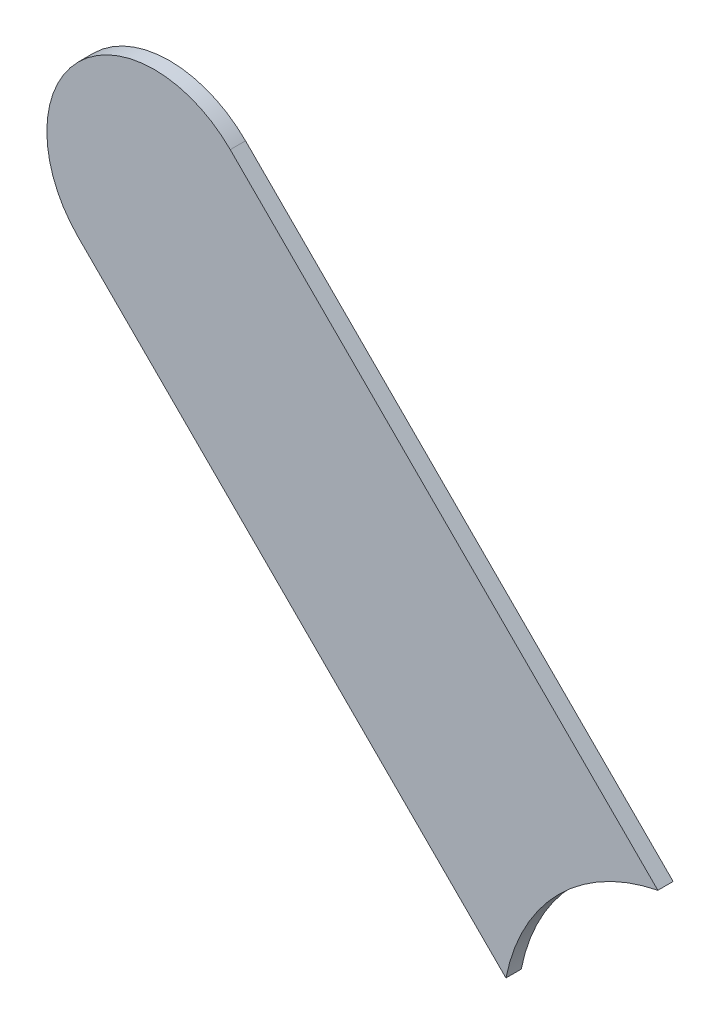
ISO-10303-21;
HEADER;
FILE_DESCRIPTION(('STEP AP214'),'2;1');
FILE_NAME('part.step','',(''),(''),'','','');
FILE_SCHEMA(('AUTOMOTIVE_DESIGN { 1 0 10303 214 1 1 1 1 }'));
ENDSEC;
DATA;
#1=APPLICATION_CONTEXT('core data for automotive mechanical design processes');
#2=APPLICATION_PROTOCOL_DEFINITION('international standard','automotive_design',2000,#1);
#3=PRODUCT_CONTEXT('',#1,'mechanical');
#4=PRODUCT('Part','Part','',(#3));
#5=PRODUCT_RELATED_PRODUCT_CATEGORY('part','',(#4));
#6=PRODUCT_DEFINITION_FORMATION('','',#4);
#7=PRODUCT_DEFINITION_CONTEXT('part definition',#1,'design');
#8=PRODUCT_DEFINITION('design','',#6,#7);
#9=PRODUCT_DEFINITION_SHAPE('','',#8);
#10=(LENGTH_UNIT() NAMED_UNIT(*) SI_UNIT(.MILLI.,.METRE.));
#11=(NAMED_UNIT(*) PLANE_ANGLE_UNIT() SI_UNIT($,.RADIAN.));
#12=(NAMED_UNIT(*) SI_UNIT($,.STERADIAN.) SOLID_ANGLE_UNIT());
#13=UNCERTAINTY_MEASURE_WITH_UNIT(LENGTH_MEASURE(1.E-05),#10,'distance_accuracy_value','');
#14=(GEOMETRIC_REPRESENTATION_CONTEXT(3) GLOBAL_UNCERTAINTY_ASSIGNED_CONTEXT((#13)) GLOBAL_UNIT_ASSIGNED_CONTEXT((#10,
#11,#12)) REPRESENTATION_CONTEXT('',''));
#15=CARTESIAN_POINT('',(0.,0.,0.));
#16=DIRECTION('',(0.,0.,1.));
#17=DIRECTION('',(1.,0.,0.));
#18=AXIS2_PLACEMENT_3D('',#15,#16,#17);
#19=CARTESIAN_POINT('',(92.39443802,110.49102362,0.));
#20=DIRECTION('',(0.707106781186548,0.707106781186548,0.));
#21=DIRECTION('',(0.707106781186548,-0.707106781186548,0.));
#22=AXIS2_PLACEMENT_3D('',#19,#20,#21);
#23=PLANE('',#22);
#24=DIRECTION('',(0.707106781186548,-0.707106781186548,0.));
#25=VECTOR('',#24,1.);
#26=CARTESIAN_POINT('',(92.39443802,110.49102362,0.03556));
#27=LINE('',#26,#25);
#28=CARTESIAN_POINT('',(92.39443802,110.49102362,0.03556));
#29=VERTEX_POINT('',#28);
#30=CARTESIAN_POINT('',(93.3896526436052,109.495808996395,0.03556));
#31=VERTEX_POINT('',#30);
#32=EDGE_CURVE('E11',#29,#31,#27,.T.);
#33=ORIENTED_EDGE('',*,*,#32,.F.);
#34=DIRECTION('',(0.,0.,1.));
#35=VECTOR('',#34,1.);
#36=CARTESIAN_POINT('',(92.39443802,110.49102362,0.));
#37=LINE('',#36,#35);
#38=CARTESIAN_POINT('',(92.39443802,110.49102362,0.));
#39=VERTEX_POINT('',#38);
#40=EDGE_CURVE('E24',#39,#29,#37,.T.);
#41=ORIENTED_EDGE('',*,*,#40,.F.);
#42=DIRECTION('',(0.707106781186548,-0.707106781186548,0.));
#43=VECTOR('',#42,1.);
#44=CARTESIAN_POINT('',(92.39443802,110.49102362,0.));
#45=LINE('',#44,#43);
#46=CARTESIAN_POINT('',(93.3896526436052,109.495808996395,0.));
#47=VERTEX_POINT('',#46);
#48=EDGE_CURVE('E75',#39,#47,#45,.T.);
#49=ORIENTED_EDGE('',*,*,#48,.T.);
#50=DIRECTION('',(0.,0.,1.));
#51=VECTOR('',#50,1.);
#52=CARTESIAN_POINT('',(93.3896526436052,109.495808996395,0.));
#53=LINE('',#52,#51);
#54=EDGE_CURVE('E37',#47,#31,#53,.T.);
#55=ORIENTED_EDGE('',*,*,#54,.T.);
#56=EDGE_LOOP('',(#33,#41,#49,#55));
#57=FACE_BOUND('',#56,.T.);
#58=ADVANCED_FACE('F17',(#57),#23,.F.);
#59=CARTESIAN_POINT('',(93.8310036,109.4080108,0.));
#60=DIRECTION('',(0.,0.,-1.));
#61=DIRECTION('',(1.,0.,0.));
#62=AXIS2_PLACEMENT_3D('',#59,#60,#61);
#63=CYLINDRICAL_SURFACE('',#62,0.4499991);
#64=DIRECTION('',(0.,0.,1.));
#65=VECTOR('',#64,1.);
#66=CARTESIAN_POINT('',(93.7432054036051,109.849361756395,0.));
#67=LINE('',#66,#65);
#68=CARTESIAN_POINT('',(93.7432054036051,109.849361756395,0.));
#69=VERTEX_POINT('',#68);
#70=CARTESIAN_POINT('',(93.7432054036051,109.849361756395,0.03556));
#71=VERTEX_POINT('',#70);
#72=EDGE_CURVE('E67',#69,#71,#67,.T.);
#73=ORIENTED_EDGE('',*,*,#72,.T.);
#74=CARTESIAN_POINT('',(93.8310036,109.4080108,0.03556));
#75=DIRECTION('',(0.,0.,1.));
#76=DIRECTION('',(1.,0.,0.));
#77=AXIS2_PLACEMENT_3D('',#74,#75,#76);
#78=CIRCLE('',#77,0.4499991);
#79=EDGE_CURVE('E82',#71,#31,#78,.T.);
#80=ORIENTED_EDGE('',*,*,#79,.T.);
#81=ORIENTED_EDGE('',*,*,#54,.F.);
#82=CARTESIAN_POINT('',(93.8310036,109.4080108,0.));
#83=DIRECTION('',(0.,0.,1.));
#84=DIRECTION('',(1.,0.,0.));
#85=AXIS2_PLACEMENT_3D('',#82,#83,#84);
#86=CIRCLE('',#85,0.4499991);
#87=EDGE_CURVE('E80',#69,#47,#86,.T.);
#88=ORIENTED_EDGE('',*,*,#87,.F.);
#89=EDGE_LOOP('',(#73,#80,#81,#88));
#90=FACE_BOUND('',#89,.T.);
#91=ADVANCED_FACE('F88',(#90),#63,.F.);
#92=CARTESIAN_POINT('',(93.7432054036051,109.849361756395,0.));
#93=DIRECTION('',(-0.707106781186548,-0.707106781186548,0.));
#94=DIRECTION('',(-0.707106781186548,0.707106781186548,0.));
#95=AXIS2_PLACEMENT_3D('',#92,#93,#94);
#96=PLANE('',#95);
#97=DIRECTION('',(-0.707106781186548,0.707106781186548,0.));
#98=VECTOR('',#97,1.);
#99=CARTESIAN_POINT('',(94.00777998,109.58478718,0.03556));
#100=LINE('',#99,#98);
#101=CARTESIAN_POINT('',(92.74799078,110.84457638,0.03556));
#102=VERTEX_POINT('',#101);
#103=EDGE_CURVE('E71',#71,#102,#100,.T.);
#104=ORIENTED_EDGE('',*,*,#103,.F.);
#105=ORIENTED_EDGE('',*,*,#72,.F.);
#106=DIRECTION('',(-0.707106781186548,0.707106781186548,0.));
#107=VECTOR('',#106,1.);
#108=CARTESIAN_POINT('',(94.00777998,109.58478718,0.));
#109=LINE('',#108,#107);
#110=CARTESIAN_POINT('',(92.74799078,110.84457638,0.));
#111=VERTEX_POINT('',#110);
#112=EDGE_CURVE('E63',#69,#111,#109,.T.);
#113=ORIENTED_EDGE('',*,*,#112,.T.);
#114=DIRECTION('',(0.,0.,1.));
#115=VECTOR('',#114,1.);
#116=CARTESIAN_POINT('',(92.74799078,110.84457638,0.));
#117=LINE('',#116,#115);
#118=EDGE_CURVE('E53',#111,#102,#117,.T.);
#119=ORIENTED_EDGE('',*,*,#118,.T.);
#120=EDGE_LOOP('',(#104,#105,#113,#119));
#121=FACE_BOUND('',#120,.T.);
#122=ADVANCED_FACE('F66',(#121),#96,.F.);
#123=CARTESIAN_POINT('',(92.5712144,110.6678,0.));
#124=DIRECTION('',(0.,0.,-1.));
#125=DIRECTION('',(0.707106781186548,0.707106781186548,0.));
#126=AXIS2_PLACEMENT_3D('',#123,#124,#125);
#127=CYLINDRICAL_SURFACE('',#126,0.249999554103216);
#128=CARTESIAN_POINT('',(92.5712144,110.6678,0.03556));
#129=DIRECTION('',(0.,0.,1.));
#130=DIRECTION('',(0.707106781186548,0.707106781186548,0.));
#131=AXIS2_PLACEMENT_3D('',#128,#129,#130);
#132=CIRCLE('',#131,0.249999554103216);
#133=EDGE_CURVE('E59',#102,#29,#132,.T.);
#134=ORIENTED_EDGE('',*,*,#133,.F.);
#135=ORIENTED_EDGE('',*,*,#118,.F.);
#136=CARTESIAN_POINT('',(92.5712144,110.6678,0.));
#137=DIRECTION('',(0.,0.,1.));
#138=DIRECTION('',(0.707106781186548,0.707106781186548,0.));
#139=AXIS2_PLACEMENT_3D('',#136,#137,#138);
#140=CIRCLE('',#139,0.249999554103216);
#141=EDGE_CURVE('E57',#111,#39,#140,.T.);
#142=ORIENTED_EDGE('',*,*,#141,.T.);
#143=ORIENTED_EDGE('',*,*,#40,.T.);
#144=EDGE_LOOP('',(#134,#135,#142,#143));
#145=FACE_BOUND('',#144,.T.);
#146=ADVANCED_FACE('F55',(#145),#127,.T.);
#147=CARTESIAN_POINT('',(92.39443802,110.49102362,0.));
#148=DIRECTION('',(0.,0.,-1.));
#149=DIRECTION('',(-1.,0.,0.));
#150=AXIS2_PLACEMENT_3D('',#147,#148,#149);
#151=PLANE('',#150);
#152=ORIENTED_EDGE('',*,*,#48,.F.);
#153=ORIENTED_EDGE('',*,*,#141,.F.);
#154=ORIENTED_EDGE('',*,*,#112,.F.);
#155=ORIENTED_EDGE('',*,*,#87,.T.);
#156=EDGE_LOOP('',(#152,#153,#154,#155));
#157=FACE_BOUND('',#156,.T.);
#158=ADVANCED_FACE('F74',(#157),#151,.T.);
#159=CARTESIAN_POINT('',(92.39443802,110.49102362,0.03556));
#160=DIRECTION('',(0.,0.,-1.));
#161=DIRECTION('',(-1.,0.,0.));
#162=AXIS2_PLACEMENT_3D('',#159,#160,#161);
#163=PLANE('',#162);
#164=ORIENTED_EDGE('',*,*,#133,.T.);
#165=ORIENTED_EDGE('',*,*,#32,.T.);
#166=ORIENTED_EDGE('',*,*,#79,.F.);
#167=ORIENTED_EDGE('',*,*,#103,.T.);
#168=EDGE_LOOP('',(#164,#165,#166,#167));
#169=FACE_BOUND('',#168,.T.);
#170=ADVANCED_FACE('F91',(#169),#163,.F.);
#171=CLOSED_SHELL('',(#58,#91,#122,#146,#158,#170));
#172=MANIFOLD_SOLID_BREP('B1',#171);
#173=ADVANCED_BREP_SHAPE_REPRESENTATION('',(#18,#172),#14);
#174=SHAPE_DEFINITION_REPRESENTATION(#9,#173);
ENDSEC;
END-ISO-10303-21;
